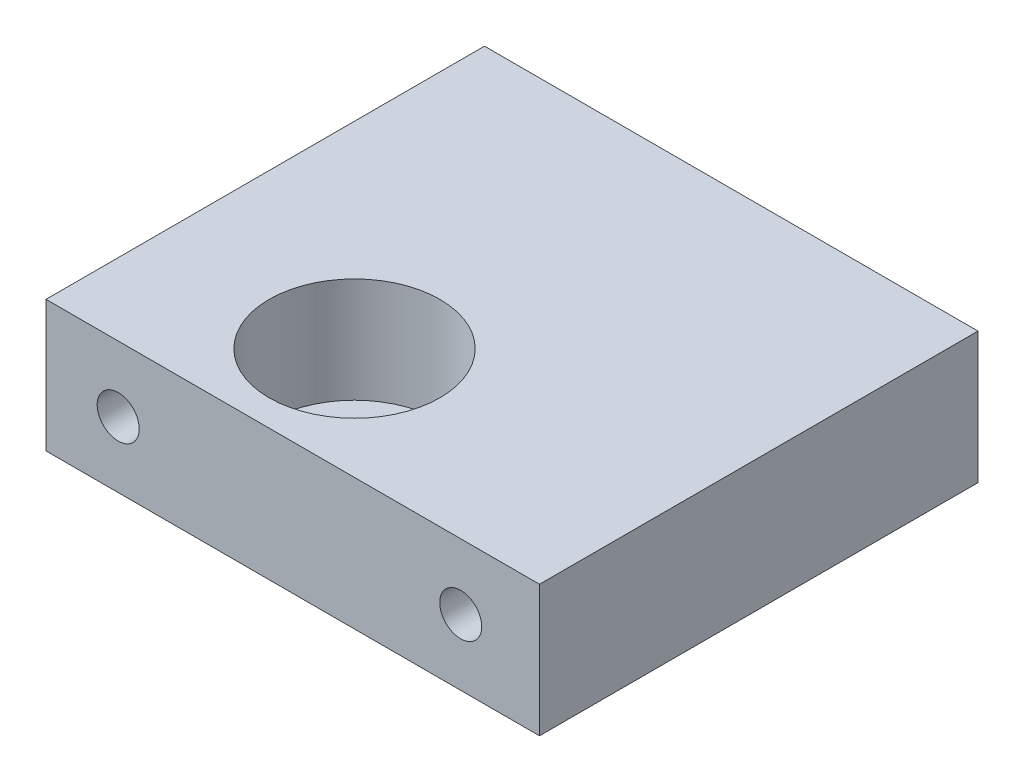
ISO-10303-21;
HEADER;
FILE_DESCRIPTION(('STEP AP214'),'2;1');
FILE_NAME('part.step','',(''),(''),'','','');
FILE_SCHEMA(('AUTOMOTIVE_DESIGN { 1 0 10303 214 1 1 1 1 }'));
ENDSEC;
DATA;
#1=APPLICATION_CONTEXT('core data for automotive mechanical design processes');
#2=APPLICATION_PROTOCOL_DEFINITION('international standard','automotive_design',2000,#1);
#3=PRODUCT_CONTEXT('',#1,'mechanical');
#4=PRODUCT('Part','Part','',(#3));
#5=PRODUCT_RELATED_PRODUCT_CATEGORY('part','',(#4));
#6=PRODUCT_DEFINITION_FORMATION('','',#4);
#7=PRODUCT_DEFINITION_CONTEXT('part definition',#1,'design');
#8=PRODUCT_DEFINITION('design','',#6,#7);
#9=PRODUCT_DEFINITION_SHAPE('','',#8);
#10=(LENGTH_UNIT() NAMED_UNIT(*) SI_UNIT(.MILLI.,.METRE.));
#11=(NAMED_UNIT(*) PLANE_ANGLE_UNIT() SI_UNIT($,.RADIAN.));
#12=(NAMED_UNIT(*) SI_UNIT($,.STERADIAN.) SOLID_ANGLE_UNIT());
#13=UNCERTAINTY_MEASURE_WITH_UNIT(LENGTH_MEASURE(1.E-05),#10,'distance_accuracy_value','');
#14=(GEOMETRIC_REPRESENTATION_CONTEXT(3) GLOBAL_UNCERTAINTY_ASSIGNED_CONTEXT((#13)) GLOBAL_UNIT_ASSIGNED_CONTEXT((#10,
#11,#12)) REPRESENTATION_CONTEXT('',''));
#15=CARTESIAN_POINT('',(0.,0.,0.));
#16=DIRECTION('',(0.,0.,1.));
#17=DIRECTION('',(1.,0.,0.));
#18=AXIS2_PLACEMENT_3D('',#15,#16,#17);
#19=CARTESIAN_POINT('',(6.21136709620178,5.58421822059647,24.9));
#20=DIRECTION('',(0.,1.,0.));
#21=DIRECTION('',(0.,0.,1.));
#22=AXIS2_PLACEMENT_3D('',#19,#20,#21);
#23=CYLINDRICAL_SURFACE('',#22,6.5);
#24=CARTESIAN_POINT('',(6.21136709620178,15.5842182205965,24.9));
#25=DIRECTION('',(0.,1.,0.));
#26=DIRECTION('',(0.,0.,1.));
#27=AXIS2_PLACEMENT_3D('',#24,#25,#26);
#28=CIRCLE('',#27,6.5);
#29=CARTESIAN_POINT('',(6.21136709620178,15.5842182205965,31.4));
#30=VERTEX_POINT('',#29);
#31=EDGE_CURVE('E108',#30,#30,#28,.T.);
#32=ORIENTED_EDGE('',*,*,#31,.T.);
#33=EDGE_LOOP('',(#32));
#34=FACE_BOUND('',#33,.T.);
#35=CARTESIAN_POINT('',(6.21136709620178,7.58421822059647,24.9));
#36=DIRECTION('',(0.,-1.,0.));
#37=DIRECTION('',(0.,0.,-1.));
#38=AXIS2_PLACEMENT_3D('',#35,#36,#37);
#39=CIRCLE('',#38,6.5);
#40=CARTESIAN_POINT('',(6.21136709620178,7.58421822059647,18.4));
#41=VERTEX_POINT('',#40);
#42=EDGE_CURVE('E11',#41,#41,#39,.F.);
#43=ORIENTED_EDGE('',*,*,#42,.F.);
#44=EDGE_LOOP('',(#43));
#45=FACE_BOUND('',#44,.T.);
#46=ADVANCED_FACE('F38',(#34,#45),#23,.F.);
#47=CARTESIAN_POINT('',(-8.78863290379822,15.5842182205965,33.4));
#48=DIRECTION('',(1.,0.,0.));
#49=DIRECTION('',(0.,0.,-1.));
#50=AXIS2_PLACEMENT_3D('',#47,#48,#49);
#51=PLANE('',#50);
#52=DIRECTION('',(0.,-1.,0.));
#53=VECTOR('',#52,1.);
#54=CARTESIAN_POINT('',(-8.78863290379822,15.5842182205965,0.));
#55=LINE('',#54,#53);
#56=CARTESIAN_POINT('',(-8.78863290379822,15.5842182205965,0.));
#57=VERTEX_POINT('',#56);
#58=CARTESIAN_POINT('',(-8.78863290379822,5.58421822059647,0.));
#59=VERTEX_POINT('',#58);
#60=EDGE_CURVE('E106',#57,#59,#55,.T.);
#61=ORIENTED_EDGE('',*,*,#60,.T.);
#62=DIRECTION('',(0.,0.,-1.));
#63=VECTOR('',#62,1.);
#64=CARTESIAN_POINT('',(-8.78863290379822,5.58421822059647,33.4));
#65=LINE('',#64,#63);
#66=CARTESIAN_POINT('',(-8.78863290379822,5.58421822059647,33.4));
#67=VERTEX_POINT('',#66);
#68=EDGE_CURVE('E47',#67,#59,#65,.T.);
#69=ORIENTED_EDGE('',*,*,#68,.F.);
#70=DIRECTION('',(0.,-1.,0.));
#71=VECTOR('',#70,1.);
#72=CARTESIAN_POINT('',(-8.78863290379822,15.5842182205965,33.4));
#73=LINE('',#72,#71);
#74=CARTESIAN_POINT('',(-8.78863290379822,15.5842182205965,33.4));
#75=VERTEX_POINT('',#74);
#76=EDGE_CURVE('E89',#75,#67,#73,.T.);
#77=ORIENTED_EDGE('',*,*,#76,.F.);
#78=DIRECTION('',(0.,0.,-1.));
#79=VECTOR('',#78,1.);
#80=CARTESIAN_POINT('',(-8.78863290379822,15.5842182205965,33.4));
#81=LINE('',#80,#79);
#82=EDGE_CURVE('E55',#75,#57,#81,.T.);
#83=ORIENTED_EDGE('',*,*,#82,.T.);
#84=EDGE_LOOP('',(#61,#69,#77,#83));
#85=FACE_BOUND('',#84,.T.);
#86=ADVANCED_FACE('F40',(#85),#51,.F.);
#87=CARTESIAN_POINT('',(-8.78863290379822,5.58421822059647,33.4));
#88=DIRECTION('',(0.,1.,0.));
#89=DIRECTION('',(0.,0.,1.));
#90=AXIS2_PLACEMENT_3D('',#87,#88,#89);
#91=PLANE('',#90);
#92=DIRECTION('',(1.,0.,0.));
#93=VECTOR('',#92,1.);
#94=CARTESIAN_POINT('',(-8.78863290379822,5.58421822059647,0.));
#95=LINE('',#94,#93);
#96=CARTESIAN_POINT('',(28.8006489733732,5.58421822059647,0.));
#97=VERTEX_POINT('',#96);
#98=EDGE_CURVE('E96',#59,#97,#95,.T.);
#99=ORIENTED_EDGE('',*,*,#98,.T.);
#100=DIRECTION('',(0.,0.,-1.));
#101=VECTOR('',#100,1.);
#102=CARTESIAN_POINT('',(28.8006489733732,5.58421822059647,33.4));
#103=LINE('',#102,#101);
#104=CARTESIAN_POINT('',(28.8006489733732,5.58421822059647,33.4));
#105=VERTEX_POINT('',#104);
#106=EDGE_CURVE('E93',#105,#97,#103,.T.);
#107=ORIENTED_EDGE('',*,*,#106,.F.);
#108=DIRECTION('',(1.,0.,0.));
#109=VECTOR('',#108,1.);
#110=CARTESIAN_POINT('',(-8.78863290379822,5.58421822059647,33.4));
#111=LINE('',#110,#109);
#112=EDGE_CURVE('E81',#67,#105,#111,.T.);
#113=ORIENTED_EDGE('',*,*,#112,.F.);
#114=ORIENTED_EDGE('',*,*,#68,.T.);
#115=EDGE_LOOP('',(#99,#107,#113,#114));
#116=FACE_BOUND('',#115,.T.);
#117=CARTESIAN_POINT('',(6.21136709620178,5.58421822059647,24.9));
#118=DIRECTION('',(0.,-1.,0.));
#119=DIRECTION('',(0.,0.,-1.));
#120=AXIS2_PLACEMENT_3D('',#117,#118,#119);
#121=CIRCLE('',#120,2.74999999999975);
#122=CARTESIAN_POINT('',(6.21136709620178,5.58421822059647,22.1500000000002));
#123=VERTEX_POINT('',#122);
#124=EDGE_CURVE('E162',#123,#123,#121,.T.);
#125=ORIENTED_EDGE('',*,*,#124,.F.);
#126=EDGE_LOOP('',(#125));
#127=FACE_BOUND('',#126,.T.);
#128=ADVANCED_FACE('F94',(#116,#127),#91,.F.);
#129=CARTESIAN_POINT('',(28.8006489733732,15.5842182205965,33.4));
#130=DIRECTION('',(1.,0.,0.));
#131=DIRECTION('',(0.,0.,-1.));
#132=AXIS2_PLACEMENT_3D('',#129,#130,#131);
#133=PLANE('',#132);
#134=DIRECTION('',(0.,-1.,0.));
#135=VECTOR('',#134,1.);
#136=CARTESIAN_POINT('',(28.8006489733732,15.5842182205965,0.));
#137=LINE('',#136,#135);
#138=CARTESIAN_POINT('',(28.8006489733732,15.5842182205965,0.));
#139=VERTEX_POINT('',#138);
#140=EDGE_CURVE('E110',#139,#97,#137,.T.);
#141=ORIENTED_EDGE('',*,*,#140,.F.);
#142=DIRECTION('',(0.,0.,-1.));
#143=VECTOR('',#142,1.);
#144=CARTESIAN_POINT('',(28.8006489733732,15.5842182205965,33.4));
#145=LINE('',#144,#143);
#146=CARTESIAN_POINT('',(28.8006489733732,15.5842182205965,33.4));
#147=VERTEX_POINT('',#146);
#148=EDGE_CURVE('E69',#147,#139,#145,.T.);
#149=ORIENTED_EDGE('',*,*,#148,.F.);
#150=DIRECTION('',(0.,-1.,0.));
#151=VECTOR('',#150,1.);
#152=CARTESIAN_POINT('',(28.8006489733732,15.5842182205965,33.4));
#153=LINE('',#152,#151);
#154=EDGE_CURVE('E88',#147,#105,#153,.T.);
#155=ORIENTED_EDGE('',*,*,#154,.T.);
#156=ORIENTED_EDGE('',*,*,#106,.T.);
#157=EDGE_LOOP('',(#141,#149,#155,#156));
#158=FACE_BOUND('',#157,.T.);
#159=ADVANCED_FACE('F100',(#158),#133,.T.);
#160=CARTESIAN_POINT('',(-8.78863290379822,15.5842182205965,33.4));
#161=DIRECTION('',(0.,1.,0.));
#162=DIRECTION('',(0.,0.,1.));
#163=AXIS2_PLACEMENT_3D('',#160,#161,#162);
#164=PLANE('',#163);
#165=ORIENTED_EDGE('',*,*,#31,.F.);
#166=EDGE_LOOP('',(#165));
#167=FACE_BOUND('',#166,.T.);
#168=DIRECTION('',(1.,0.,0.));
#169=VECTOR('',#168,1.);
#170=CARTESIAN_POINT('',(-8.78863290379822,15.5842182205965,0.));
#171=LINE('',#170,#169);
#172=EDGE_CURVE('E112',#57,#139,#171,.T.);
#173=ORIENTED_EDGE('',*,*,#172,.F.);
#174=ORIENTED_EDGE('',*,*,#82,.F.);
#175=DIRECTION('',(1.,0.,0.));
#176=VECTOR('',#175,1.);
#177=CARTESIAN_POINT('',(-8.78863290379822,15.5842182205965,33.4));
#178=LINE('',#177,#176);
#179=EDGE_CURVE('E101',#75,#147,#178,.T.);
#180=ORIENTED_EDGE('',*,*,#179,.T.);
#181=ORIENTED_EDGE('',*,*,#148,.T.);
#182=EDGE_LOOP('',(#173,#174,#180,#181));
#183=FACE_BOUND('',#182,.T.);
#184=ADVANCED_FACE('F118',(#167,#183),#164,.T.);
#185=CARTESIAN_POINT('',(0.,0.,33.4));
#186=DIRECTION('',(0.,0.,1.));
#187=DIRECTION('',(1.,0.,0.));
#188=AXIS2_PLACEMENT_3D('',#185,#186,#187);
#189=PLANE('',#188);
#190=CARTESIAN_POINT('',(-3.28863290379822,10.5842182205965,33.4));
#191=DIRECTION('',(0.,0.,1.));
#192=DIRECTION('',(1.,0.,0.));
#193=AXIS2_PLACEMENT_3D('',#190,#191,#192);
#194=CIRCLE('',#193,1.6);
#195=CARTESIAN_POINT('',(-1.68863290379822,10.5842182205965,33.4));
#196=VERTEX_POINT('',#195);
#197=EDGE_CURVE('E168',#196,#196,#194,.F.);
#198=ORIENTED_EDGE('',*,*,#197,.T.);
#199=EDGE_LOOP('',(#198));
#200=FACE_BOUND('',#199,.T.);
#201=CARTESIAN_POINT('',(22.8006489733732,10.5842182205965,33.4));
#202=DIRECTION('',(0.,0.,1.));
#203=DIRECTION('',(1.,0.,0.));
#204=AXIS2_PLACEMENT_3D('',#201,#202,#203);
#205=CIRCLE('',#204,1.6);
#206=CARTESIAN_POINT('',(24.4006489733732,10.5842182205965,33.4));
#207=VERTEX_POINT('',#206);
#208=EDGE_CURVE('E159',#207,#207,#205,.F.);
#209=ORIENTED_EDGE('',*,*,#208,.T.);
#210=EDGE_LOOP('',(#209));
#211=FACE_BOUND('',#210,.T.);
#212=ORIENTED_EDGE('',*,*,#76,.T.);
#213=ORIENTED_EDGE('',*,*,#112,.T.);
#214=ORIENTED_EDGE('',*,*,#154,.F.);
#215=ORIENTED_EDGE('',*,*,#179,.F.);
#216=EDGE_LOOP('',(#212,#213,#214,#215));
#217=FACE_BOUND('',#216,.T.);
#218=ADVANCED_FACE('F85',(#200,#211,#217),#189,.T.);
#219=CARTESIAN_POINT('',(0.,0.,0.));
#220=DIRECTION('',(0.,0.,1.));
#221=DIRECTION('',(1.,0.,0.));
#222=AXIS2_PLACEMENT_3D('',#219,#220,#221);
#223=PLANE('',#222);
#224=CARTESIAN_POINT('',(-3.28863290379822,10.5842182205965,0.));
#225=DIRECTION('',(0.,0.,1.));
#226=DIRECTION('',(1.,0.,0.));
#227=AXIS2_PLACEMENT_3D('',#224,#225,#226);
#228=CIRCLE('',#227,1.6);
#229=CARTESIAN_POINT('',(-1.68863290379822,10.5842182205965,0.));
#230=VERTEX_POINT('',#229);
#231=EDGE_CURVE('E152',#230,#230,#228,.T.);
#232=ORIENTED_EDGE('',*,*,#231,.T.);
#233=EDGE_LOOP('',(#232));
#234=FACE_BOUND('',#233,.T.);
#235=CARTESIAN_POINT('',(22.8006489733732,10.5842182205965,0.));
#236=DIRECTION('',(0.,0.,1.));
#237=DIRECTION('',(1.,0.,0.));
#238=AXIS2_PLACEMENT_3D('',#235,#236,#237);
#239=CIRCLE('',#238,1.6);
#240=CARTESIAN_POINT('',(24.4006489733732,10.5842182205965,0.));
#241=VERTEX_POINT('',#240);
#242=EDGE_CURVE('E155',#241,#241,#239,.T.);
#243=ORIENTED_EDGE('',*,*,#242,.T.);
#244=EDGE_LOOP('',(#243));
#245=FACE_BOUND('',#244,.T.);
#246=ORIENTED_EDGE('',*,*,#60,.F.);
#247=ORIENTED_EDGE('',*,*,#172,.T.);
#248=ORIENTED_EDGE('',*,*,#140,.T.);
#249=ORIENTED_EDGE('',*,*,#98,.F.);
#250=EDGE_LOOP('',(#246,#247,#248,#249));
#251=FACE_BOUND('',#250,.T.);
#252=ADVANCED_FACE('F117',(#234,#245,#251),#223,.F.);
#253=CARTESIAN_POINT('',(22.8006489733732,10.5842182205965,40.));
#254=DIRECTION('',(0.,0.,-1.));
#255=DIRECTION('',(-1.,0.,0.));
#256=AXIS2_PLACEMENT_3D('',#253,#254,#255);
#257=CYLINDRICAL_SURFACE('',#256,1.6);
#258=ORIENTED_EDGE('',*,*,#208,.F.);
#259=EDGE_LOOP('',(#258));
#260=FACE_BOUND('',#259,.T.);
#261=ORIENTED_EDGE('',*,*,#242,.F.);
#262=EDGE_LOOP('',(#261));
#263=FACE_BOUND('',#262,.T.);
#264=ADVANCED_FACE('F140',(#260,#263),#257,.F.);
#265=CARTESIAN_POINT('',(-3.28863290379822,10.5842182205965,40.));
#266=DIRECTION('',(0.,0.,-1.));
#267=DIRECTION('',(-1.,0.,0.));
#268=AXIS2_PLACEMENT_3D('',#265,#266,#267);
#269=CYLINDRICAL_SURFACE('',#268,1.6);
#270=ORIENTED_EDGE('',*,*,#197,.F.);
#271=EDGE_LOOP('',(#270));
#272=FACE_BOUND('',#271,.T.);
#273=ORIENTED_EDGE('',*,*,#231,.F.);
#274=EDGE_LOOP('',(#273));
#275=FACE_BOUND('',#274,.T.);
#276=ADVANCED_FACE('F147',(#272,#275),#269,.F.);
#277=CARTESIAN_POINT('',(6.21136709620178,7.58421822059647,24.9));
#278=DIRECTION('',(0.,-1.,0.));
#279=DIRECTION('',(0.,0.,-1.));
#280=AXIS2_PLACEMENT_3D('',#277,#278,#279);
#281=PLANE('',#280);
#282=CARTESIAN_POINT('',(6.21136709620178,7.58421822059647,24.9));
#283=DIRECTION('',(0.,-1.,0.));
#284=DIRECTION('',(0.,0.,-1.));
#285=AXIS2_PLACEMENT_3D('',#282,#283,#284);
#286=CIRCLE('',#285,2.74999999999975);
#287=CARTESIAN_POINT('',(6.21136709620178,7.58421822059647,22.1500000000002));
#288=VERTEX_POINT('',#287);
#289=EDGE_CURVE('E157',#288,#288,#286,.T.);
#290=ORIENTED_EDGE('',*,*,#289,.T.);
#291=EDGE_LOOP('',(#290));
#292=FACE_BOUND('',#291,.T.);
#293=ORIENTED_EDGE('',*,*,#42,.T.);
#294=EDGE_LOOP('',(#293));
#295=FACE_BOUND('',#294,.T.);
#296=ADVANCED_FACE('F176',(#292,#295),#281,.F.);
#297=CARTESIAN_POINT('',(6.21136709620178,7.58421822059647,24.9));
#298=DIRECTION('',(0.,-1.,0.));
#299=DIRECTION('',(0.,0.,-1.));
#300=AXIS2_PLACEMENT_3D('',#297,#298,#299);
#301=CYLINDRICAL_SURFACE('',#300,2.74999999999975);
#302=ORIENTED_EDGE('',*,*,#289,.F.);
#303=EDGE_LOOP('',(#302));
#304=FACE_BOUND('',#303,.T.);
#305=ORIENTED_EDGE('',*,*,#124,.T.);
#306=EDGE_LOOP('',(#305));
#307=FACE_BOUND('',#306,.T.);
#308=ADVANCED_FACE('F180',(#304,#307),#301,.F.);
#309=CLOSED_SHELL('',(#46,#86,#128,#159,#184,#218,#252,#264,#276,#296,#308));
#310=MANIFOLD_SOLID_BREP('B2',#309);
#311=ADVANCED_BREP_SHAPE_REPRESENTATION('',(#18,#310),#14);
#312=SHAPE_DEFINITION_REPRESENTATION(#9,#311);
ENDSEC;
END-ISO-10303-21;
